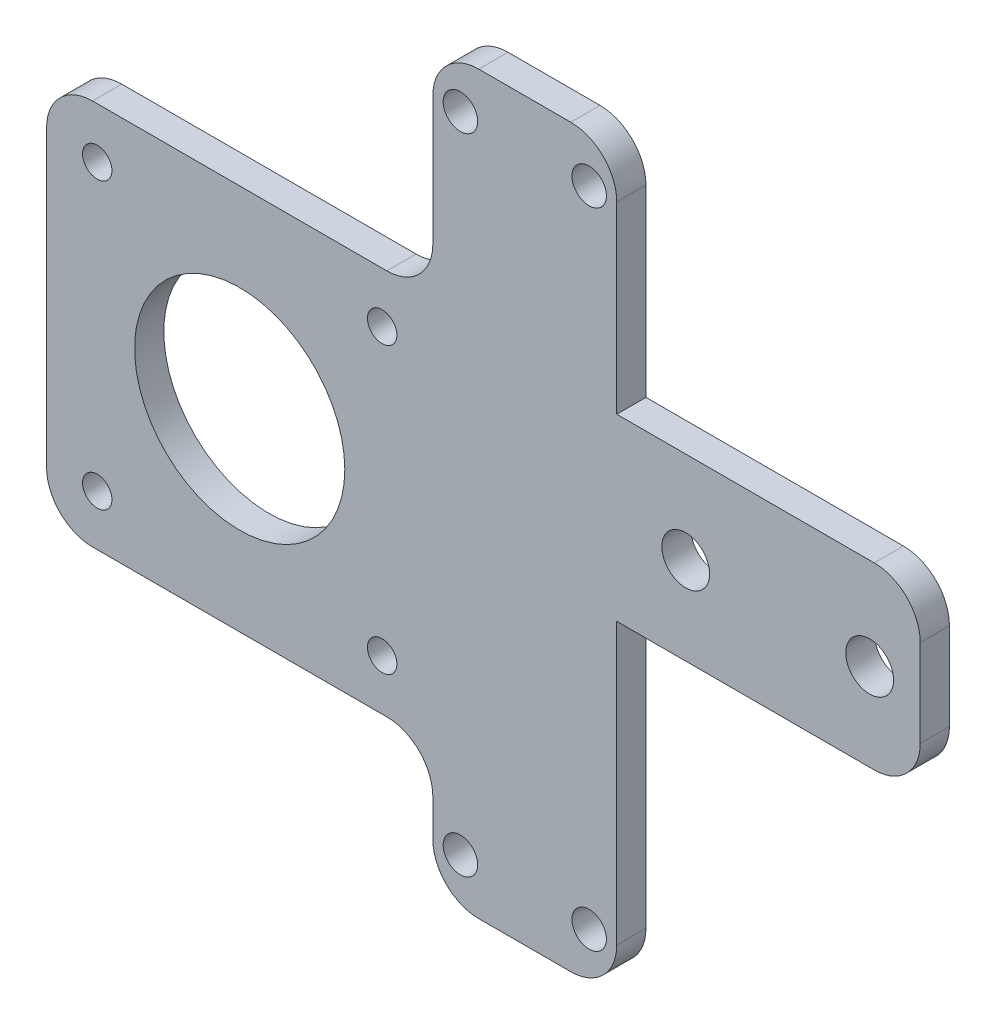
ISO-10303-21;
HEADER;
FILE_DESCRIPTION(('STEP AP214'),'2;1');
FILE_NAME('part.step','',(''),(''),'','','');
FILE_SCHEMA(('AUTOMOTIVE_DESIGN { 1 0 10303 214 1 1 1 1 }'));
ENDSEC;
DATA;
#1=APPLICATION_CONTEXT('core data for automotive mechanical design processes');
#2=APPLICATION_PROTOCOL_DEFINITION('international standard','automotive_design',2000,#1);
#3=PRODUCT_CONTEXT('',#1,'mechanical');
#4=PRODUCT('Part','Part','',(#3));
#5=PRODUCT_RELATED_PRODUCT_CATEGORY('part','',(#4));
#6=PRODUCT_DEFINITION_FORMATION('','',#4);
#7=PRODUCT_DEFINITION_CONTEXT('part definition',#1,'design');
#8=PRODUCT_DEFINITION('design','',#6,#7);
#9=PRODUCT_DEFINITION_SHAPE('','',#8);
#10=(LENGTH_UNIT() NAMED_UNIT(*) SI_UNIT(.MILLI.,.METRE.));
#11=(NAMED_UNIT(*) PLANE_ANGLE_UNIT() SI_UNIT($,.RADIAN.));
#12=(NAMED_UNIT(*) SI_UNIT($,.STERADIAN.) SOLID_ANGLE_UNIT());
#13=UNCERTAINTY_MEASURE_WITH_UNIT(LENGTH_MEASURE(1.E-05),#10,'distance_accuracy_value','');
#14=(GEOMETRIC_REPRESENTATION_CONTEXT(3) GLOBAL_UNCERTAINTY_ASSIGNED_CONTEXT((#13)) GLOBAL_UNIT_ASSIGNED_CONTEXT((#10,
#11,#12)) REPRESENTATION_CONTEXT('',''));
#15=CARTESIAN_POINT('',(0.,0.,0.));
#16=DIRECTION('',(0.,0.,1.));
#17=DIRECTION('',(1.,0.,0.));
#18=AXIS2_PLACEMENT_3D('',#15,#16,#17);
#19=CARTESIAN_POINT('',(-37.,51.,0.));
#20=DIRECTION('',(0.,0.,1.));
#21=DIRECTION('',(1.,0.,0.));
#22=AXIS2_PLACEMENT_3D('',#19,#20,#21);
#23=CYLINDRICAL_SURFACE('',#22,4.99999999999999);
#24=CARTESIAN_POINT('',(-37.,51.,3.175));
#25=DIRECTION('',(0.,0.,1.));
#26=DIRECTION('',(1.,0.,0.));
#27=AXIS2_PLACEMENT_3D('',#24,#25,#26);
#28=CIRCLE('',#27,4.99999999999999);
#29=CARTESIAN_POINT('',(-37.,56.,3.175));
#30=VERTEX_POINT('',#29);
#31=CARTESIAN_POINT('',(-42.,51.,3.175));
#32=VERTEX_POINT('',#31);
#33=EDGE_CURVE('E215',#30,#32,#28,.T.);
#34=ORIENTED_EDGE('',*,*,#33,.F.);
#35=DIRECTION('',(0.,0.,1.));
#36=VECTOR('',#35,1.);
#37=CARTESIAN_POINT('',(-37.,56.,0.));
#38=LINE('',#37,#36);
#39=CARTESIAN_POINT('',(-37.,56.,0.));
#40=VERTEX_POINT('',#39);
#41=EDGE_CURVE('E11',#40,#30,#38,.T.);
#42=ORIENTED_EDGE('',*,*,#41,.F.);
#43=CARTESIAN_POINT('',(-37.,51.,0.));
#44=DIRECTION('',(0.,0.,1.));
#45=DIRECTION('',(1.,0.,0.));
#46=AXIS2_PLACEMENT_3D('',#43,#44,#45);
#47=CIRCLE('',#46,4.99999999999999);
#48=CARTESIAN_POINT('',(-42.,51.,0.));
#49=VERTEX_POINT('',#48);
#50=EDGE_CURVE('E278',#40,#49,#47,.T.);
#51=ORIENTED_EDGE('',*,*,#50,.T.);
#52=DIRECTION('',(0.,0.,1.));
#53=VECTOR('',#52,1.);
#54=CARTESIAN_POINT('',(-42.,51.,0.));
#55=LINE('',#54,#53);
#56=EDGE_CURVE('E37',#49,#32,#55,.T.);
#57=ORIENTED_EDGE('',*,*,#56,.T.);
#58=EDGE_LOOP('',(#34,#42,#51,#57));
#59=FACE_BOUND('',#58,.T.);
#60=ADVANCED_FACE('F34',(#59),#23,.T.);
#61=CARTESIAN_POINT('',(-5.,56.,0.));
#62=DIRECTION('',(0.,1.,0.));
#63=DIRECTION('',(0.,0.,1.));
#64=AXIS2_PLACEMENT_3D('',#61,#62,#63);
#65=PLANE('',#64);
#66=DIRECTION('',(-1.,0.,0.));
#67=VECTOR('',#66,1.);
#68=CARTESIAN_POINT('',(-5.,56.,3.175));
#69=LINE('',#68,#67);
#70=CARTESIAN_POINT('',(-5.,56.,3.175));
#71=VERTEX_POINT('',#70);
#72=EDGE_CURVE('E276',#71,#30,#69,.T.);
#73=ORIENTED_EDGE('',*,*,#72,.F.);
#74=DIRECTION('',(0.,0.,1.));
#75=VECTOR('',#74,1.);
#76=CARTESIAN_POINT('',(-5.,56.,0.));
#77=LINE('',#76,#75);
#78=CARTESIAN_POINT('',(-5.,56.,0.));
#79=VERTEX_POINT('',#78);
#80=EDGE_CURVE('E43',#79,#71,#77,.T.);
#81=ORIENTED_EDGE('',*,*,#80,.F.);
#82=DIRECTION('',(-1.,0.,0.));
#83=VECTOR('',#82,1.);
#84=CARTESIAN_POINT('',(-5.,56.,0.));
#85=LINE('',#84,#83);
#86=EDGE_CURVE('E205',#79,#40,#85,.T.);
#87=ORIENTED_EDGE('',*,*,#86,.T.);
#88=ORIENTED_EDGE('',*,*,#41,.T.);
#89=EDGE_LOOP('',(#73,#81,#87,#88));
#90=FACE_BOUND('',#89,.T.);
#91=ADVANCED_FACE('F318',(#90),#65,.T.);
#92=CARTESIAN_POINT('',(-5.,61.,0.));
#93=DIRECTION('',(0.,0.,1.));
#94=DIRECTION('',(1.,0.,0.));
#95=AXIS2_PLACEMENT_3D('',#92,#93,#94);
#96=CYLINDRICAL_SURFACE('',#95,5.);
#97=CARTESIAN_POINT('',(-5.,61.,3.175));
#98=DIRECTION('',(0.,0.,-1.));
#99=DIRECTION('',(-1.,0.,0.));
#100=AXIS2_PLACEMENT_3D('',#97,#98,#99);
#101=CIRCLE('',#100,5.);
#102=CARTESIAN_POINT('',(0.,61.,3.175));
#103=VERTEX_POINT('',#102);
#104=EDGE_CURVE('E192',#103,#71,#101,.T.);
#105=ORIENTED_EDGE('',*,*,#104,.F.);
#106=DIRECTION('',(0.,0.,1.));
#107=VECTOR('',#106,1.);
#108=CARTESIAN_POINT('',(0.,61.,0.));
#109=LINE('',#108,#107);
#110=CARTESIAN_POINT('',(0.,61.,0.));
#111=VERTEX_POINT('',#110);
#112=EDGE_CURVE('E187',#111,#103,#109,.T.);
#113=ORIENTED_EDGE('',*,*,#112,.F.);
#114=CARTESIAN_POINT('',(-5.,61.,0.));
#115=DIRECTION('',(0.,0.,-1.));
#116=DIRECTION('',(-1.,0.,0.));
#117=AXIS2_PLACEMENT_3D('',#114,#115,#116);
#118=CIRCLE('',#117,5.);
#119=EDGE_CURVE('E190',#111,#79,#118,.T.);
#120=ORIENTED_EDGE('',*,*,#119,.T.);
#121=ORIENTED_EDGE('',*,*,#80,.T.);
#122=EDGE_LOOP('',(#105,#113,#120,#121));
#123=FACE_BOUND('',#122,.T.);
#124=ADVANCED_FACE('F189',(#123),#96,.F.);
#125=CARTESIAN_POINT('',(0.,75.,0.));
#126=DIRECTION('',(-1.,0.,0.));
#127=DIRECTION('',(0.,-1.,0.));
#128=AXIS2_PLACEMENT_3D('',#125,#126,#127);
#129=PLANE('',#128);
#130=DIRECTION('',(0.,-1.,0.));
#131=VECTOR('',#130,1.);
#132=CARTESIAN_POINT('',(0.,75.,3.175));
#133=LINE('',#132,#131);
#134=CARTESIAN_POINT('',(0.,75.,3.175));
#135=VERTEX_POINT('',#134);
#136=EDGE_CURVE('E273',#135,#103,#133,.T.);
#137=ORIENTED_EDGE('',*,*,#136,.F.);
#138=DIRECTION('',(0.,0.,1.));
#139=VECTOR('',#138,1.);
#140=CARTESIAN_POINT('',(0.,75.,0.));
#141=LINE('',#140,#139);
#142=CARTESIAN_POINT('',(0.,75.,0.));
#143=VERTEX_POINT('',#142);
#144=EDGE_CURVE('E197',#143,#135,#141,.T.);
#145=ORIENTED_EDGE('',*,*,#144,.F.);
#146=DIRECTION('',(0.,-1.,0.));
#147=VECTOR('',#146,1.);
#148=CARTESIAN_POINT('',(0.,75.,0.));
#149=LINE('',#148,#147);
#150=EDGE_CURVE('E203',#143,#111,#149,.T.);
#151=ORIENTED_EDGE('',*,*,#150,.T.);
#152=ORIENTED_EDGE('',*,*,#112,.T.);
#153=EDGE_LOOP('',(#137,#145,#151,#152));
#154=FACE_BOUND('',#153,.T.);
#155=ADVANCED_FACE('F207',(#154),#129,.T.);
#156=CARTESIAN_POINT('',(5.,75.,0.));
#157=DIRECTION('',(0.,0.,1.));
#158=DIRECTION('',(1.,0.,0.));
#159=AXIS2_PLACEMENT_3D('',#156,#157,#158);
#160=CYLINDRICAL_SURFACE('',#159,5.);
#161=CARTESIAN_POINT('',(5.,75.,3.175));
#162=DIRECTION('',(0.,0.,1.));
#163=DIRECTION('',(1.,0.,0.));
#164=AXIS2_PLACEMENT_3D('',#161,#162,#163);
#165=CIRCLE('',#164,5.);
#166=CARTESIAN_POINT('',(5.,80.,3.175));
#167=VERTEX_POINT('',#166);
#168=EDGE_CURVE('E270',#167,#135,#165,.T.);
#169=ORIENTED_EDGE('',*,*,#168,.F.);
#170=DIRECTION('',(0.,0.,1.));
#171=VECTOR('',#170,1.);
#172=CARTESIAN_POINT('',(5.,80.,0.));
#173=LINE('',#172,#171);
#174=CARTESIAN_POINT('',(5.,80.,0.));
#175=VERTEX_POINT('',#174);
#176=EDGE_CURVE('E282',#175,#167,#173,.T.);
#177=ORIENTED_EDGE('',*,*,#176,.F.);
#178=CARTESIAN_POINT('',(5.,75.,0.));
#179=DIRECTION('',(0.,0.,1.));
#180=DIRECTION('',(1.,0.,0.));
#181=AXIS2_PLACEMENT_3D('',#178,#179,#180);
#182=CIRCLE('',#181,5.);
#183=EDGE_CURVE('E208',#175,#143,#182,.T.);
#184=ORIENTED_EDGE('',*,*,#183,.T.);
#185=ORIENTED_EDGE('',*,*,#144,.T.);
#186=EDGE_LOOP('',(#169,#177,#184,#185));
#187=FACE_BOUND('',#186,.T.);
#188=ADVANCED_FACE('F331',(#187),#160,.T.);
#189=CARTESIAN_POINT('',(15.,80.,0.));
#190=DIRECTION('',(0.,1.,0.));
#191=DIRECTION('',(0.,0.,1.));
#192=AXIS2_PLACEMENT_3D('',#189,#190,#191);
#193=PLANE('',#192);
#194=DIRECTION('',(-1.,0.,0.));
#195=VECTOR('',#194,1.);
#196=CARTESIAN_POINT('',(15.,80.,3.175));
#197=LINE('',#196,#195);
#198=CARTESIAN_POINT('',(15.,80.,3.175));
#199=VERTEX_POINT('',#198);
#200=EDGE_CURVE('E267',#199,#167,#197,.T.);
#201=ORIENTED_EDGE('',*,*,#200,.F.);
#202=DIRECTION('',(0.,0.,1.));
#203=VECTOR('',#202,1.);
#204=CARTESIAN_POINT('',(15.,80.,0.));
#205=LINE('',#204,#203);
#206=CARTESIAN_POINT('',(15.,80.,0.));
#207=VERTEX_POINT('',#206);
#208=EDGE_CURVE('E284',#207,#199,#205,.T.);
#209=ORIENTED_EDGE('',*,*,#208,.F.);
#210=DIRECTION('',(-1.,0.,0.));
#211=VECTOR('',#210,1.);
#212=CARTESIAN_POINT('',(15.,80.,0.));
#213=LINE('',#212,#211);
#214=EDGE_CURVE('E210',#207,#175,#213,.T.);
#215=ORIENTED_EDGE('',*,*,#214,.T.);
#216=ORIENTED_EDGE('',*,*,#176,.T.);
#217=EDGE_LOOP('',(#201,#209,#215,#216));
#218=FACE_BOUND('',#217,.T.);
#219=ADVANCED_FACE('F334',(#218),#193,.T.);
#220=CARTESIAN_POINT('',(15.,75.,0.));
#221=DIRECTION('',(0.,0.,1.));
#222=DIRECTION('',(1.,0.,0.));
#223=AXIS2_PLACEMENT_3D('',#220,#221,#222);
#224=CYLINDRICAL_SURFACE('',#223,5.);
#225=CARTESIAN_POINT('',(15.,75.,3.175));
#226=DIRECTION('',(0.,0.,1.));
#227=DIRECTION('',(1.,0.,0.));
#228=AXIS2_PLACEMENT_3D('',#225,#226,#227);
#229=CIRCLE('',#228,5.);
#230=CARTESIAN_POINT('',(20.,75.,3.175));
#231=VERTEX_POINT('',#230);
#232=EDGE_CURVE('E264',#231,#199,#229,.T.);
#233=ORIENTED_EDGE('',*,*,#232,.F.);
#234=DIRECTION('',(0.,0.,1.));
#235=VECTOR('',#234,1.);
#236=CARTESIAN_POINT('',(20.,75.,0.));
#237=LINE('',#236,#235);
#238=CARTESIAN_POINT('',(20.,75.,0.));
#239=VERTEX_POINT('',#238);
#240=EDGE_CURVE('E286',#239,#231,#237,.T.);
#241=ORIENTED_EDGE('',*,*,#240,.F.);
#242=CARTESIAN_POINT('',(15.,75.,0.));
#243=DIRECTION('',(0.,0.,1.));
#244=DIRECTION('',(1.,0.,0.));
#245=AXIS2_PLACEMENT_3D('',#242,#243,#244);
#246=CIRCLE('',#245,5.);
#247=EDGE_CURVE('E568',#239,#207,#246,.T.);
#248=ORIENTED_EDGE('',*,*,#247,.T.);
#249=ORIENTED_EDGE('',*,*,#208,.T.);
#250=EDGE_LOOP('',(#233,#241,#248,#249));
#251=FACE_BOUND('',#250,.T.);
#252=ADVANCED_FACE('F338',(#251),#224,.T.);
#253=CARTESIAN_POINT('',(20.,55.,0.));
#254=DIRECTION('',(1.,0.,0.));
#255=DIRECTION('',(0.,1.,0.));
#256=AXIS2_PLACEMENT_3D('',#253,#254,#255);
#257=PLANE('',#256);
#258=DIRECTION('',(0.,1.,0.));
#259=VECTOR('',#258,1.);
#260=CARTESIAN_POINT('',(20.,55.,3.175));
#261=LINE('',#260,#259);
#262=CARTESIAN_POINT('',(20.,55.,3.175));
#263=VERTEX_POINT('',#262);
#264=EDGE_CURVE('E261',#263,#231,#261,.T.);
#265=ORIENTED_EDGE('',*,*,#264,.F.);
#266=DIRECTION('',(0.,0.,1.));
#267=VECTOR('',#266,1.);
#268=CARTESIAN_POINT('',(20.,55.,0.));
#269=LINE('',#268,#267);
#270=CARTESIAN_POINT('',(20.,55.,0.));
#271=VERTEX_POINT('',#270);
#272=EDGE_CURVE('E288',#271,#263,#269,.T.);
#273=ORIENTED_EDGE('',*,*,#272,.F.);
#274=DIRECTION('',(0.,1.,0.));
#275=VECTOR('',#274,1.);
#276=CARTESIAN_POINT('',(20.,55.,0.));
#277=LINE('',#276,#275);
#278=EDGE_CURVE('E565',#271,#239,#277,.T.);
#279=ORIENTED_EDGE('',*,*,#278,.T.);
#280=ORIENTED_EDGE('',*,*,#240,.T.);
#281=EDGE_LOOP('',(#265,#273,#279,#280));
#282=FACE_BOUND('',#281,.T.);
#283=ADVANCED_FACE('F342',(#282),#257,.T.);
#284=CARTESIAN_POINT('',(48.,55.,0.));
#285=DIRECTION('',(0.,1.,0.));
#286=DIRECTION('',(0.,0.,1.));
#287=AXIS2_PLACEMENT_3D('',#284,#285,#286);
#288=PLANE('',#287);
#289=DIRECTION('',(-1.,0.,0.));
#290=VECTOR('',#289,1.);
#291=CARTESIAN_POINT('',(48.,55.,3.175));
#292=LINE('',#291,#290);
#293=CARTESIAN_POINT('',(48.,55.,3.175));
#294=VERTEX_POINT('',#293);
#295=EDGE_CURVE('E258',#294,#263,#292,.T.);
#296=ORIENTED_EDGE('',*,*,#295,.F.);
#297=DIRECTION('',(0.,0.,1.));
#298=VECTOR('',#297,1.);
#299=CARTESIAN_POINT('',(48.,55.,0.));
#300=LINE('',#299,#298);
#301=CARTESIAN_POINT('',(48.,55.,0.));
#302=VERTEX_POINT('',#301);
#303=EDGE_CURVE('E290',#302,#294,#300,.T.);
#304=ORIENTED_EDGE('',*,*,#303,.F.);
#305=DIRECTION('',(-1.,0.,0.));
#306=VECTOR('',#305,1.);
#307=CARTESIAN_POINT('',(48.,55.,0.));
#308=LINE('',#307,#306);
#309=EDGE_CURVE('E562',#302,#271,#308,.T.);
#310=ORIENTED_EDGE('',*,*,#309,.T.);
#311=ORIENTED_EDGE('',*,*,#272,.T.);
#312=EDGE_LOOP('',(#296,#304,#310,#311));
#313=FACE_BOUND('',#312,.T.);
#314=ADVANCED_FACE('F346',(#313),#288,.T.);
#315=CARTESIAN_POINT('',(48.,50.,0.));
#316=DIRECTION('',(0.,0.,1.));
#317=DIRECTION('',(1.,0.,0.));
#318=AXIS2_PLACEMENT_3D('',#315,#316,#317);
#319=CYLINDRICAL_SURFACE('',#318,5.);
#320=CARTESIAN_POINT('',(48.,50.,3.175));
#321=DIRECTION('',(0.,0.,1.));
#322=DIRECTION('',(1.,0.,0.));
#323=AXIS2_PLACEMENT_3D('',#320,#321,#322);
#324=CIRCLE('',#323,5.);
#325=CARTESIAN_POINT('',(53.,50.,3.175));
#326=VERTEX_POINT('',#325);
#327=EDGE_CURVE('E255',#326,#294,#324,.T.);
#328=ORIENTED_EDGE('',*,*,#327,.F.);
#329=DIRECTION('',(0.,0.,1.));
#330=VECTOR('',#329,1.);
#331=CARTESIAN_POINT('',(53.,50.,0.));
#332=LINE('',#331,#330);
#333=CARTESIAN_POINT('',(53.,50.,0.));
#334=VERTEX_POINT('',#333);
#335=EDGE_CURVE('E292',#334,#326,#332,.T.);
#336=ORIENTED_EDGE('',*,*,#335,.F.);
#337=CARTESIAN_POINT('',(48.,50.,0.));
#338=DIRECTION('',(0.,0.,1.));
#339=DIRECTION('',(1.,0.,0.));
#340=AXIS2_PLACEMENT_3D('',#337,#338,#339);
#341=CIRCLE('',#340,5.);
#342=EDGE_CURVE('E559',#334,#302,#341,.T.);
#343=ORIENTED_EDGE('',*,*,#342,.T.);
#344=ORIENTED_EDGE('',*,*,#303,.T.);
#345=EDGE_LOOP('',(#328,#336,#343,#344));
#346=FACE_BOUND('',#345,.T.);
#347=ADVANCED_FACE('F350',(#346),#319,.T.);
#348=CARTESIAN_POINT('',(53.,40.4999995231628,0.));
#349=DIRECTION('',(1.,0.,0.));
#350=DIRECTION('',(0.,0.,-1.));
#351=AXIS2_PLACEMENT_3D('',#348,#349,#350);
#352=PLANE('',#351);
#353=DIRECTION('',(0.,1.,0.));
#354=VECTOR('',#353,1.);
#355=CARTESIAN_POINT('',(53.,40.4999995231628,3.175));
#356=LINE('',#355,#354);
#357=CARTESIAN_POINT('',(53.,40.4999995231628,3.175));
#358=VERTEX_POINT('',#357);
#359=EDGE_CURVE('E252',#358,#326,#356,.T.);
#360=ORIENTED_EDGE('',*,*,#359,.F.);
#361=DIRECTION('',(0.,0.,1.));
#362=VECTOR('',#361,1.);
#363=CARTESIAN_POINT('',(53.,40.4999995231628,0.));
#364=LINE('',#363,#362);
#365=CARTESIAN_POINT('',(53.,40.4999995231628,0.));
#366=VERTEX_POINT('',#365);
#367=EDGE_CURVE('E294',#366,#358,#364,.T.);
#368=ORIENTED_EDGE('',*,*,#367,.F.);
#369=DIRECTION('',(0.,1.,0.));
#370=VECTOR('',#369,1.);
#371=CARTESIAN_POINT('',(53.,40.4999995231628,0.));
#372=LINE('',#371,#370);
#373=EDGE_CURVE('E556',#366,#334,#372,.T.);
#374=ORIENTED_EDGE('',*,*,#373,.T.);
#375=ORIENTED_EDGE('',*,*,#335,.T.);
#376=EDGE_LOOP('',(#360,#368,#374,#375));
#377=FACE_BOUND('',#376,.T.);
#378=ADVANCED_FACE('F354',(#377),#352,.T.);
#379=CARTESIAN_POINT('',(48.,40.4999995231628,0.));
#380=DIRECTION('',(0.,0.,1.));
#381=DIRECTION('',(1.,0.,0.));
#382=AXIS2_PLACEMENT_3D('',#379,#380,#381);
#383=CYLINDRICAL_SURFACE('',#382,5.);
#384=CARTESIAN_POINT('',(48.,40.4999995231628,3.175));
#385=DIRECTION('',(0.,0.,1.));
#386=DIRECTION('',(1.,0.,0.));
#387=AXIS2_PLACEMENT_3D('',#384,#385,#386);
#388=CIRCLE('',#387,5.);
#389=CARTESIAN_POINT('',(48.,35.4999995231628,3.175));
#390=VERTEX_POINT('',#389);
#391=EDGE_CURVE('E249',#390,#358,#388,.T.);
#392=ORIENTED_EDGE('',*,*,#391,.F.);
#393=DIRECTION('',(0.,0.,1.));
#394=VECTOR('',#393,1.);
#395=CARTESIAN_POINT('',(48.,35.4999995231628,0.));
#396=LINE('',#395,#394);
#397=CARTESIAN_POINT('',(48.,35.4999995231628,0.));
#398=VERTEX_POINT('',#397);
#399=EDGE_CURVE('E296',#398,#390,#396,.T.);
#400=ORIENTED_EDGE('',*,*,#399,.F.);
#401=CARTESIAN_POINT('',(48.,40.4999995231628,0.));
#402=DIRECTION('',(0.,0.,1.));
#403=DIRECTION('',(1.,0.,0.));
#404=AXIS2_PLACEMENT_3D('',#401,#402,#403);
#405=CIRCLE('',#404,5.);
#406=EDGE_CURVE('E553',#398,#366,#405,.T.);
#407=ORIENTED_EDGE('',*,*,#406,.T.);
#408=ORIENTED_EDGE('',*,*,#367,.T.);
#409=EDGE_LOOP('',(#392,#400,#407,#408));
#410=FACE_BOUND('',#409,.T.);
#411=ADVANCED_FACE('F358',(#410),#383,.T.);
#412=CARTESIAN_POINT('',(20.,35.4999995231628,0.));
#413=DIRECTION('',(0.,-1.,0.));
#414=DIRECTION('',(0.,0.,-1.));
#415=AXIS2_PLACEMENT_3D('',#412,#413,#414);
#416=PLANE('',#415);
#417=DIRECTION('',(1.,0.,0.));
#418=VECTOR('',#417,1.);
#419=CARTESIAN_POINT('',(20.,35.4999995231628,3.175));
#420=LINE('',#419,#418);
#421=CARTESIAN_POINT('',(20.,35.4999995231628,3.175));
#422=VERTEX_POINT('',#421);
#423=EDGE_CURVE('E246',#422,#390,#420,.T.);
#424=ORIENTED_EDGE('',*,*,#423,.F.);
#425=DIRECTION('',(0.,0.,1.));
#426=VECTOR('',#425,1.);
#427=CARTESIAN_POINT('',(20.,35.4999995231628,0.));
#428=LINE('',#427,#426);
#429=CARTESIAN_POINT('',(20.,35.4999995231628,0.));
#430=VERTEX_POINT('',#429);
#431=EDGE_CURVE('E298',#430,#422,#428,.T.);
#432=ORIENTED_EDGE('',*,*,#431,.F.);
#433=DIRECTION('',(1.,0.,0.));
#434=VECTOR('',#433,1.);
#435=CARTESIAN_POINT('',(20.,35.4999995231628,0.));
#436=LINE('',#435,#434);
#437=EDGE_CURVE('E550',#430,#398,#436,.T.);
#438=ORIENTED_EDGE('',*,*,#437,.T.);
#439=ORIENTED_EDGE('',*,*,#399,.T.);
#440=EDGE_LOOP('',(#424,#432,#438,#439));
#441=FACE_BOUND('',#440,.T.);
#442=ADVANCED_FACE('F362',(#441),#416,.T.);
#443=CARTESIAN_POINT('',(20.,5.,0.));
#444=DIRECTION('',(1.,0.,0.));
#445=DIRECTION('',(0.,1.,0.));
#446=AXIS2_PLACEMENT_3D('',#443,#444,#445);
#447=PLANE('',#446);
#448=DIRECTION('',(0.,1.,0.));
#449=VECTOR('',#448,1.);
#450=CARTESIAN_POINT('',(20.,5.,3.175));
#451=LINE('',#450,#449);
#452=CARTESIAN_POINT('',(20.,5.,3.175));
#453=VERTEX_POINT('',#452);
#454=EDGE_CURVE('E243',#453,#422,#451,.T.);
#455=ORIENTED_EDGE('',*,*,#454,.F.);
#456=DIRECTION('',(0.,0.,1.));
#457=VECTOR('',#456,1.);
#458=CARTESIAN_POINT('',(20.,5.,0.));
#459=LINE('',#458,#457);
#460=CARTESIAN_POINT('',(20.,5.,0.));
#461=VERTEX_POINT('',#460);
#462=EDGE_CURVE('E300',#461,#453,#459,.T.);
#463=ORIENTED_EDGE('',*,*,#462,.F.);
#464=DIRECTION('',(0.,1.,0.));
#465=VECTOR('',#464,1.);
#466=CARTESIAN_POINT('',(20.,5.,0.));
#467=LINE('',#466,#465);
#468=EDGE_CURVE('E547',#461,#430,#467,.T.);
#469=ORIENTED_EDGE('',*,*,#468,.T.);
#470=ORIENTED_EDGE('',*,*,#431,.T.);
#471=EDGE_LOOP('',(#455,#463,#469,#470));
#472=FACE_BOUND('',#471,.T.);
#473=ADVANCED_FACE('F366',(#472),#447,.T.);
#474=CARTESIAN_POINT('',(15.,5.,0.));
#475=DIRECTION('',(0.,0.,1.));
#476=DIRECTION('',(1.,0.,0.));
#477=AXIS2_PLACEMENT_3D('',#474,#475,#476);
#478=CYLINDRICAL_SURFACE('',#477,5.);
#479=CARTESIAN_POINT('',(15.,5.,3.175));
#480=DIRECTION('',(0.,0.,1.));
#481=DIRECTION('',(1.,0.,0.));
#482=AXIS2_PLACEMENT_3D('',#479,#480,#481);
#483=CIRCLE('',#482,5.);
#484=CARTESIAN_POINT('',(15.,0.,3.175));
#485=VERTEX_POINT('',#484);
#486=EDGE_CURVE('E240',#485,#453,#483,.T.);
#487=ORIENTED_EDGE('',*,*,#486,.F.);
#488=DIRECTION('',(0.,0.,1.));
#489=VECTOR('',#488,1.);
#490=CARTESIAN_POINT('',(15.,0.,0.));
#491=LINE('',#490,#489);
#492=CARTESIAN_POINT('',(15.,0.,0.));
#493=VERTEX_POINT('',#492);
#494=EDGE_CURVE('E302',#493,#485,#491,.T.);
#495=ORIENTED_EDGE('',*,*,#494,.F.);
#496=CARTESIAN_POINT('',(15.,5.,0.));
#497=DIRECTION('',(0.,0.,1.));
#498=DIRECTION('',(1.,0.,0.));
#499=AXIS2_PLACEMENT_3D('',#496,#497,#498);
#500=CIRCLE('',#499,5.);
#501=EDGE_CURVE('E544',#493,#461,#500,.T.);
#502=ORIENTED_EDGE('',*,*,#501,.T.);
#503=ORIENTED_EDGE('',*,*,#462,.T.);
#504=EDGE_LOOP('',(#487,#495,#502,#503));
#505=FACE_BOUND('',#504,.T.);
#506=ADVANCED_FACE('F370',(#505),#478,.T.);
#507=CARTESIAN_POINT('',(5.,0.,0.));
#508=DIRECTION('',(0.,-1.,0.));
#509=DIRECTION('',(0.,0.,-1.));
#510=AXIS2_PLACEMENT_3D('',#507,#508,#509);
#511=PLANE('',#510);
#512=DIRECTION('',(1.,0.,0.));
#513=VECTOR('',#512,1.);
#514=CARTESIAN_POINT('',(5.,0.,3.175));
#515=LINE('',#514,#513);
#516=CARTESIAN_POINT('',(5.,0.,3.175));
#517=VERTEX_POINT('',#516);
#518=EDGE_CURVE('E237',#517,#485,#515,.T.);
#519=ORIENTED_EDGE('',*,*,#518,.F.);
#520=DIRECTION('',(0.,0.,1.));
#521=VECTOR('',#520,1.);
#522=CARTESIAN_POINT('',(5.,0.,0.));
#523=LINE('',#522,#521);
#524=CARTESIAN_POINT('',(5.,0.,0.));
#525=VERTEX_POINT('',#524);
#526=EDGE_CURVE('E304',#525,#517,#523,.T.);
#527=ORIENTED_EDGE('',*,*,#526,.F.);
#528=DIRECTION('',(1.,0.,0.));
#529=VECTOR('',#528,1.);
#530=CARTESIAN_POINT('',(5.,0.,0.));
#531=LINE('',#530,#529);
#532=EDGE_CURVE('E541',#525,#493,#531,.T.);
#533=ORIENTED_EDGE('',*,*,#532,.T.);
#534=ORIENTED_EDGE('',*,*,#494,.T.);
#535=EDGE_LOOP('',(#519,#527,#533,#534));
#536=FACE_BOUND('',#535,.T.);
#537=ADVANCED_FACE('F374',(#536),#511,.T.);
#538=CARTESIAN_POINT('',(5.,5.,0.));
#539=DIRECTION('',(0.,0.,1.));
#540=DIRECTION('',(1.,0.,0.));
#541=AXIS2_PLACEMENT_3D('',#538,#539,#540);
#542=CYLINDRICAL_SURFACE('',#541,5.);
#543=CARTESIAN_POINT('',(5.,5.,3.175));
#544=DIRECTION('',(0.,0.,1.));
#545=DIRECTION('',(1.,0.,0.));
#546=AXIS2_PLACEMENT_3D('',#543,#544,#545);
#547=CIRCLE('',#546,5.);
#548=CARTESIAN_POINT('',(0.,5.,3.175));
#549=VERTEX_POINT('',#548);
#550=EDGE_CURVE('E234',#549,#517,#547,.T.);
#551=ORIENTED_EDGE('',*,*,#550,.F.);
#552=DIRECTION('',(0.,0.,1.));
#553=VECTOR('',#552,1.);
#554=CARTESIAN_POINT('',(0.,5.,0.));
#555=LINE('',#554,#553);
#556=CARTESIAN_POINT('',(0.,5.,0.));
#557=VERTEX_POINT('',#556);
#558=EDGE_CURVE('E306',#557,#549,#555,.T.);
#559=ORIENTED_EDGE('',*,*,#558,.F.);
#560=CARTESIAN_POINT('',(5.,5.,0.));
#561=DIRECTION('',(0.,0.,1.));
#562=DIRECTION('',(1.,0.,0.));
#563=AXIS2_PLACEMENT_3D('',#560,#561,#562);
#564=CIRCLE('',#563,5.);
#565=EDGE_CURVE('E538',#557,#525,#564,.T.);
#566=ORIENTED_EDGE('',*,*,#565,.T.);
#567=ORIENTED_EDGE('',*,*,#526,.T.);
#568=EDGE_LOOP('',(#551,#559,#566,#567));
#569=FACE_BOUND('',#568,.T.);
#570=ADVANCED_FACE('F378',(#569),#542,.T.);
#571=CARTESIAN_POINT('',(0.,9.00000000000001,0.));
#572=DIRECTION('',(-1.,0.,0.));
#573=DIRECTION('',(0.,0.,1.));
#574=AXIS2_PLACEMENT_3D('',#571,#572,#573);
#575=PLANE('',#574);
#576=DIRECTION('',(0.,-1.,0.));
#577=VECTOR('',#576,1.);
#578=CARTESIAN_POINT('',(0.,9.00000000000001,3.175));
#579=LINE('',#578,#577);
#580=CARTESIAN_POINT('',(0.,9.00000000000001,3.175));
#581=VERTEX_POINT('',#580);
#582=EDGE_CURVE('E231',#581,#549,#579,.T.);
#583=ORIENTED_EDGE('',*,*,#582,.F.);
#584=DIRECTION('',(0.,0.,1.));
#585=VECTOR('',#584,1.);
#586=CARTESIAN_POINT('',(0.,9.00000000000001,0.));
#587=LINE('',#586,#585);
#588=CARTESIAN_POINT('',(0.,9.00000000000001,0.));
#589=VERTEX_POINT('',#588);
#590=EDGE_CURVE('E308',#589,#581,#587,.T.);
#591=ORIENTED_EDGE('',*,*,#590,.F.);
#592=DIRECTION('',(0.,-1.,0.));
#593=VECTOR('',#592,1.);
#594=CARTESIAN_POINT('',(0.,9.00000000000001,0.));
#595=LINE('',#594,#593);
#596=EDGE_CURVE('E535',#589,#557,#595,.T.);
#597=ORIENTED_EDGE('',*,*,#596,.T.);
#598=ORIENTED_EDGE('',*,*,#558,.T.);
#599=EDGE_LOOP('',(#583,#591,#597,#598));
#600=FACE_BOUND('',#599,.T.);
#601=ADVANCED_FACE('F382',(#600),#575,.T.);
#602=CARTESIAN_POINT('',(-5.,9.00000000000001,0.));
#603=DIRECTION('',(0.,0.,1.));
#604=DIRECTION('',(1.,0.,0.));
#605=AXIS2_PLACEMENT_3D('',#602,#603,#604);
#606=CYLINDRICAL_SURFACE('',#605,5.);
#607=CARTESIAN_POINT('',(-5.,9.00000000000001,3.175));
#608=DIRECTION('',(0.,0.,-1.));
#609=DIRECTION('',(-1.,0.,0.));
#610=AXIS2_PLACEMENT_3D('',#607,#608,#609);
#611=CIRCLE('',#610,5.);
#612=CARTESIAN_POINT('',(-5.,14.,3.175));
#613=VERTEX_POINT('',#612);
#614=EDGE_CURVE('E228',#613,#581,#611,.T.);
#615=ORIENTED_EDGE('',*,*,#614,.F.);
#616=DIRECTION('',(0.,0.,1.));
#617=VECTOR('',#616,1.);
#618=CARTESIAN_POINT('',(-5.,14.,0.));
#619=LINE('',#618,#617);
#620=CARTESIAN_POINT('',(-5.,14.,0.));
#621=VERTEX_POINT('',#620);
#622=EDGE_CURVE('E310',#621,#613,#619,.T.);
#623=ORIENTED_EDGE('',*,*,#622,.F.);
#624=CARTESIAN_POINT('',(-5.,9.00000000000001,0.));
#625=DIRECTION('',(0.,0.,-1.));
#626=DIRECTION('',(-1.,0.,0.));
#627=AXIS2_PLACEMENT_3D('',#624,#625,#626);
#628=CIRCLE('',#627,5.);
#629=EDGE_CURVE('E532',#621,#589,#628,.T.);
#630=ORIENTED_EDGE('',*,*,#629,.T.);
#631=ORIENTED_EDGE('',*,*,#590,.T.);
#632=EDGE_LOOP('',(#615,#623,#630,#631));
#633=FACE_BOUND('',#632,.T.);
#634=ADVANCED_FACE('F386',(#633),#606,.F.);
#635=CARTESIAN_POINT('',(-37.,14.,0.));
#636=DIRECTION('',(0.,-1.,0.));
#637=DIRECTION('',(1.,0.,0.));
#638=AXIS2_PLACEMENT_3D('',#635,#636,#637);
#639=PLANE('',#638);
#640=DIRECTION('',(1.,0.,0.));
#641=VECTOR('',#640,1.);
#642=CARTESIAN_POINT('',(-37.,14.,3.175));
#643=LINE('',#642,#641);
#644=CARTESIAN_POINT('',(-37.,14.,3.175));
#645=VERTEX_POINT('',#644);
#646=EDGE_CURVE('E225',#645,#613,#643,.T.);
#647=ORIENTED_EDGE('',*,*,#646,.F.);
#648=DIRECTION('',(0.,0.,1.));
#649=VECTOR('',#648,1.);
#650=CARTESIAN_POINT('',(-37.,14.,0.));
#651=LINE('',#650,#649);
#652=CARTESIAN_POINT('',(-37.,14.,0.));
#653=VERTEX_POINT('',#652);
#654=EDGE_CURVE('E312',#653,#645,#651,.T.);
#655=ORIENTED_EDGE('',*,*,#654,.F.);
#656=DIRECTION('',(1.,0.,0.));
#657=VECTOR('',#656,1.);
#658=CARTESIAN_POINT('',(-37.,14.,0.));
#659=LINE('',#658,#657);
#660=EDGE_CURVE('E529',#653,#621,#659,.T.);
#661=ORIENTED_EDGE('',*,*,#660,.T.);
#662=ORIENTED_EDGE('',*,*,#622,.T.);
#663=EDGE_LOOP('',(#647,#655,#661,#662));
#664=FACE_BOUND('',#663,.T.);
#665=ADVANCED_FACE('F390',(#664),#639,.T.);
#666=CARTESIAN_POINT('',(-37.,19.,0.));
#667=DIRECTION('',(0.,0.,1.));
#668=DIRECTION('',(1.,0.,0.));
#669=AXIS2_PLACEMENT_3D('',#666,#667,#668);
#670=CYLINDRICAL_SURFACE('',#669,5.);
#671=CARTESIAN_POINT('',(-37.,19.,3.175));
#672=DIRECTION('',(0.,0.,1.));
#673=DIRECTION('',(1.,0.,0.));
#674=AXIS2_PLACEMENT_3D('',#671,#672,#673);
#675=CIRCLE('',#674,5.);
#676=CARTESIAN_POINT('',(-42.,19.,3.175));
#677=VERTEX_POINT('',#676);
#678=EDGE_CURVE('E222',#677,#645,#675,.T.);
#679=ORIENTED_EDGE('',*,*,#678,.F.);
#680=DIRECTION('',(0.,0.,1.));
#681=VECTOR('',#680,1.);
#682=CARTESIAN_POINT('',(-42.,19.,0.));
#683=LINE('',#682,#681);
#684=CARTESIAN_POINT('',(-42.,19.,0.));
#685=VERTEX_POINT('',#684);
#686=EDGE_CURVE('E313',#685,#677,#683,.T.);
#687=ORIENTED_EDGE('',*,*,#686,.F.);
#688=CARTESIAN_POINT('',(-37.,19.,0.));
#689=DIRECTION('',(0.,0.,1.));
#690=DIRECTION('',(1.,0.,0.));
#691=AXIS2_PLACEMENT_3D('',#688,#689,#690);
#692=CIRCLE('',#691,5.);
#693=EDGE_CURVE('E526',#685,#653,#692,.T.);
#694=ORIENTED_EDGE('',*,*,#693,.T.);
#695=ORIENTED_EDGE('',*,*,#654,.T.);
#696=EDGE_LOOP('',(#679,#687,#694,#695));
#697=FACE_BOUND('',#696,.T.);
#698=ADVANCED_FACE('F394',(#697),#670,.T.);
#699=CARTESIAN_POINT('',(-42.,51.,0.));
#700=DIRECTION('',(-1.,0.,0.));
#701=DIRECTION('',(0.,-1.,0.));
#702=AXIS2_PLACEMENT_3D('',#699,#700,#701);
#703=PLANE('',#702);
#704=DIRECTION('',(0.,-1.,0.));
#705=VECTOR('',#704,1.);
#706=CARTESIAN_POINT('',(-42.,51.,3.175));
#707=LINE('',#706,#705);
#708=EDGE_CURVE('E218',#32,#677,#707,.T.);
#709=ORIENTED_EDGE('',*,*,#708,.F.);
#710=ORIENTED_EDGE('',*,*,#56,.F.);
#711=DIRECTION('',(0.,-1.,0.));
#712=VECTOR('',#711,1.);
#713=CARTESIAN_POINT('',(-42.,51.,0.));
#714=LINE('',#713,#712);
#715=EDGE_CURVE('E524',#49,#685,#714,.T.);
#716=ORIENTED_EDGE('',*,*,#715,.T.);
#717=ORIENTED_EDGE('',*,*,#686,.T.);
#718=EDGE_LOOP('',(#709,#710,#716,#717));
#719=FACE_BOUND('',#718,.T.);
#720=ADVANCED_FACE('F315',(#719),#703,.T.);
#721=CARTESIAN_POINT('',(-37.,51.,0.));
#722=DIRECTION('',(0.,0.,1.));
#723=DIRECTION('',(1.,0.,0.));
#724=AXIS2_PLACEMENT_3D('',#721,#722,#723);
#725=PLANE('',#724);
#726=CARTESIAN_POINT('',(-21.,35.,0.));
#727=DIRECTION('',(0.,0.,1.));
#728=DIRECTION('',(1.,0.,0.));
#729=AXIS2_PLACEMENT_3D('',#726,#727,#728);
#730=CIRCLE('',#729,11.43);
#731=CARTESIAN_POINT('',(-9.57000000000001,35.,0.));
#732=VERTEX_POINT('',#731);
#733=EDGE_CURVE('E457',#732,#732,#730,.T.);
#734=ORIENTED_EDGE('',*,*,#733,.T.);
#735=EDGE_LOOP('',(#734));
#736=FACE_BOUND('',#735,.T.);
#737=CARTESIAN_POINT('',(-36.4909418088443,50.4909418088443,0.));
#738=DIRECTION('',(0.,0.,1.));
#739=DIRECTION('',(1.,0.,0.));
#740=AXIS2_PLACEMENT_3D('',#737,#738,#739);
#741=CIRCLE('',#740,1.59999999999998);
#742=CARTESIAN_POINT('',(-34.8909418088443,50.4909418088443,0.));
#743=VERTEX_POINT('',#742);
#744=EDGE_CURVE('E467',#743,#743,#741,.T.);
#745=ORIENTED_EDGE('',*,*,#744,.T.);
#746=EDGE_LOOP('',(#745));
#747=FACE_BOUND('',#746,.T.);
#748=CARTESIAN_POINT('',(-5.50905819115572,50.4909418088443,0.));
#749=DIRECTION('',(0.,0.,1.));
#750=DIRECTION('',(1.,0.,0.));
#751=AXIS2_PLACEMENT_3D('',#748,#749,#750);
#752=CIRCLE('',#751,1.59999999999998);
#753=CARTESIAN_POINT('',(-3.90905819115574,50.4909418088443,0.));
#754=VERTEX_POINT('',#753);
#755=EDGE_CURVE('E473',#754,#754,#752,.T.);
#756=ORIENTED_EDGE('',*,*,#755,.T.);
#757=EDGE_LOOP('',(#756));
#758=FACE_BOUND('',#757,.T.);
#759=CARTESIAN_POINT('',(-5.50905819115571,19.5090581911557,0.));
#760=DIRECTION('',(0.,0.,1.));
#761=DIRECTION('',(1.,0.,0.));
#762=AXIS2_PLACEMENT_3D('',#759,#760,#761);
#763=CIRCLE('',#762,1.59999999999998);
#764=CARTESIAN_POINT('',(-3.90905819115573,19.5090581911557,0.));
#765=VERTEX_POINT('',#764);
#766=EDGE_CURVE('E479',#765,#765,#763,.T.);
#767=ORIENTED_EDGE('',*,*,#766,.T.);
#768=EDGE_LOOP('',(#767));
#769=FACE_BOUND('',#768,.T.);
#770=CARTESIAN_POINT('',(-36.4909418088443,19.5090581911557,0.));
#771=DIRECTION('',(0.,0.,1.));
#772=DIRECTION('',(1.,0.,0.));
#773=AXIS2_PLACEMENT_3D('',#770,#771,#772);
#774=CIRCLE('',#773,1.59999999999998);
#775=CARTESIAN_POINT('',(-34.8909418088443,19.5090581911557,0.));
#776=VERTEX_POINT('',#775);
#777=EDGE_CURVE('E485',#776,#776,#774,.T.);
#778=ORIENTED_EDGE('',*,*,#777,.T.);
#779=EDGE_LOOP('',(#778));
#780=FACE_BOUND('',#779,.T.);
#781=CARTESIAN_POINT('',(47.5,45.,0.));
#782=DIRECTION('',(0.,0.,1.));
#783=DIRECTION('',(1.,0.,0.));
#784=AXIS2_PLACEMENT_3D('',#781,#782,#783);
#785=CIRCLE('',#784,2.59999999999998);
#786=CARTESIAN_POINT('',(50.1,45.,0.));
#787=VERTEX_POINT('',#786);
#788=EDGE_CURVE('E491',#787,#787,#785,.T.);
#789=ORIENTED_EDGE('',*,*,#788,.T.);
#790=EDGE_LOOP('',(#789));
#791=FACE_BOUND('',#790,.T.);
#792=CARTESIAN_POINT('',(27.5,45.,0.));
#793=DIRECTION('',(0.,0.,1.));
#794=DIRECTION('',(1.,0.,0.));
#795=AXIS2_PLACEMENT_3D('',#792,#793,#794);
#796=CIRCLE('',#795,2.59999999999998);
#797=CARTESIAN_POINT('',(30.1,45.,0.));
#798=VERTEX_POINT('',#797);
#799=EDGE_CURVE('E497',#798,#798,#796,.T.);
#800=ORIENTED_EDGE('',*,*,#799,.T.);
#801=EDGE_LOOP('',(#800));
#802=FACE_BOUND('',#801,.T.);
#803=CARTESIAN_POINT('',(17.,75.,0.));
#804=DIRECTION('',(0.,0.,1.));
#805=DIRECTION('',(1.,0.,0.));
#806=AXIS2_PLACEMENT_3D('',#803,#804,#805);
#807=CIRCLE('',#806,1.87499999999999);
#808=CARTESIAN_POINT('',(18.875,75.,0.));
#809=VERTEX_POINT('',#808);
#810=EDGE_CURVE('E503',#809,#809,#807,.T.);
#811=ORIENTED_EDGE('',*,*,#810,.T.);
#812=EDGE_LOOP('',(#811));
#813=FACE_BOUND('',#812,.T.);
#814=CARTESIAN_POINT('',(2.99999999999999,5.,0.));
#815=DIRECTION('',(0.,0.,1.));
#816=DIRECTION('',(1.,0.,0.));
#817=AXIS2_PLACEMENT_3D('',#814,#815,#816);
#818=CIRCLE('',#817,1.87499999999999);
#819=CARTESIAN_POINT('',(4.87499999999998,5.,0.));
#820=VERTEX_POINT('',#819);
#821=EDGE_CURVE('E509',#820,#820,#818,.T.);
#822=ORIENTED_EDGE('',*,*,#821,.T.);
#823=EDGE_LOOP('',(#822));
#824=FACE_BOUND('',#823,.T.);
#825=CARTESIAN_POINT('',(2.99999999999999,75.,0.));
#826=DIRECTION('',(0.,0.,1.));
#827=DIRECTION('',(1.,0.,0.));
#828=AXIS2_PLACEMENT_3D('',#825,#826,#827);
#829=CIRCLE('',#828,1.87499999999999);
#830=CARTESIAN_POINT('',(4.87499999999998,75.,0.));
#831=VERTEX_POINT('',#830);
#832=EDGE_CURVE('E515',#831,#831,#829,.T.);
#833=ORIENTED_EDGE('',*,*,#832,.T.);
#834=EDGE_LOOP('',(#833));
#835=FACE_BOUND('',#834,.T.);
#836=CARTESIAN_POINT('',(17.,5.,0.));
#837=DIRECTION('',(0.,0.,1.));
#838=DIRECTION('',(1.,0.,0.));
#839=AXIS2_PLACEMENT_3D('',#836,#837,#838);
#840=CIRCLE('',#839,1.87499999999999);
#841=CARTESIAN_POINT('',(18.875,5.,0.));
#842=VERTEX_POINT('',#841);
#843=EDGE_CURVE('E219',#842,#842,#840,.T.);
#844=ORIENTED_EDGE('',*,*,#843,.T.);
#845=EDGE_LOOP('',(#844));
#846=FACE_BOUND('',#845,.T.);
#847=ORIENTED_EDGE('',*,*,#50,.F.);
#848=ORIENTED_EDGE('',*,*,#86,.F.);
#849=ORIENTED_EDGE('',*,*,#119,.F.);
#850=ORIENTED_EDGE('',*,*,#150,.F.);
#851=ORIENTED_EDGE('',*,*,#183,.F.);
#852=ORIENTED_EDGE('',*,*,#214,.F.);
#853=ORIENTED_EDGE('',*,*,#247,.F.);
#854=ORIENTED_EDGE('',*,*,#278,.F.);
#855=ORIENTED_EDGE('',*,*,#309,.F.);
#856=ORIENTED_EDGE('',*,*,#342,.F.);
#857=ORIENTED_EDGE('',*,*,#373,.F.);
#858=ORIENTED_EDGE('',*,*,#406,.F.);
#859=ORIENTED_EDGE('',*,*,#437,.F.);
#860=ORIENTED_EDGE('',*,*,#468,.F.);
#861=ORIENTED_EDGE('',*,*,#501,.F.);
#862=ORIENTED_EDGE('',*,*,#532,.F.);
#863=ORIENTED_EDGE('',*,*,#565,.F.);
#864=ORIENTED_EDGE('',*,*,#596,.F.);
#865=ORIENTED_EDGE('',*,*,#629,.F.);
#866=ORIENTED_EDGE('',*,*,#660,.F.);
#867=ORIENTED_EDGE('',*,*,#693,.F.);
#868=ORIENTED_EDGE('',*,*,#715,.F.);
#869=EDGE_LOOP('',(#847,#848,#849,#850,#851,#852,#853,#854,#855,#856,#857,#858,#859,#860,#861,
#862,#863,#864,#865,#866,#867,#868));
#870=FACE_BOUND('',#869,.T.);
#871=ADVANCED_FACE('F201',(#736,#747,#758,#769,#780,#791,#802,#813,#824,#835,#846,#870),#725,.F.);
#872=CARTESIAN_POINT('',(-37.,51.,3.175));
#873=DIRECTION('',(0.,0.,1.));
#874=DIRECTION('',(1.,0.,0.));
#875=AXIS2_PLACEMENT_3D('',#872,#873,#874);
#876=PLANE('',#875);
#877=CARTESIAN_POINT('',(-21.,35.,3.175));
#878=DIRECTION('',(0.,0.,1.));
#879=DIRECTION('',(1.,0.,0.));
#880=AXIS2_PLACEMENT_3D('',#877,#878,#879);
#881=CIRCLE('',#880,11.43);
#882=CARTESIAN_POINT('',(-9.57000000000001,35.,3.175));
#883=VERTEX_POINT('',#882);
#884=EDGE_CURVE('E460',#883,#883,#881,.T.);
#885=ORIENTED_EDGE('',*,*,#884,.F.);
#886=EDGE_LOOP('',(#885));
#887=FACE_BOUND('',#886,.T.);
#888=CARTESIAN_POINT('',(-36.4909418088443,50.4909418088443,3.175));
#889=DIRECTION('',(0.,0.,1.));
#890=DIRECTION('',(1.,0.,0.));
#891=AXIS2_PLACEMENT_3D('',#888,#889,#890);
#892=CIRCLE('',#891,1.59999999999998);
#893=CARTESIAN_POINT('',(-34.8909418088443,50.4909418088443,3.175));
#894=VERTEX_POINT('',#893);
#895=EDGE_CURVE('E462',#894,#894,#892,.T.);
#896=ORIENTED_EDGE('',*,*,#895,.F.);
#897=EDGE_LOOP('',(#896));
#898=FACE_BOUND('',#897,.T.);
#899=CARTESIAN_POINT('',(-5.50905819115572,50.4909418088443,3.175));
#900=DIRECTION('',(0.,0.,1.));
#901=DIRECTION('',(1.,0.,0.));
#902=AXIS2_PLACEMENT_3D('',#899,#900,#901);
#903=CIRCLE('',#902,1.59999999999999);
#904=CARTESIAN_POINT('',(-3.90905819115574,50.4909418088443,3.175));
#905=VERTEX_POINT('',#904);
#906=EDGE_CURVE('E470',#905,#905,#903,.T.);
#907=ORIENTED_EDGE('',*,*,#906,.F.);
#908=EDGE_LOOP('',(#907));
#909=FACE_BOUND('',#908,.T.);
#910=CARTESIAN_POINT('',(-5.50905819115571,19.5090581911557,3.175));
#911=DIRECTION('',(0.,0.,1.));
#912=DIRECTION('',(1.,0.,0.));
#913=AXIS2_PLACEMENT_3D('',#910,#911,#912);
#914=CIRCLE('',#913,1.59999999999999);
#915=CARTESIAN_POINT('',(-3.90905819115572,19.5090581911557,3.175));
#916=VERTEX_POINT('',#915);
#917=EDGE_CURVE('E476',#916,#916,#914,.T.);
#918=ORIENTED_EDGE('',*,*,#917,.F.);
#919=EDGE_LOOP('',(#918));
#920=FACE_BOUND('',#919,.T.);
#921=CARTESIAN_POINT('',(-36.4909418088443,19.5090581911557,3.175));
#922=DIRECTION('',(0.,0.,1.));
#923=DIRECTION('',(1.,0.,0.));
#924=AXIS2_PLACEMENT_3D('',#921,#922,#923);
#925=CIRCLE('',#924,1.59999999999998);
#926=CARTESIAN_POINT('',(-34.8909418088443,19.5090581911557,3.175));
#927=VERTEX_POINT('',#926);
#928=EDGE_CURVE('E482',#927,#927,#925,.T.);
#929=ORIENTED_EDGE('',*,*,#928,.F.);
#930=EDGE_LOOP('',(#929));
#931=FACE_BOUND('',#930,.T.);
#932=CARTESIAN_POINT('',(47.5,45.,3.175));
#933=DIRECTION('',(0.,0.,1.));
#934=DIRECTION('',(1.,0.,0.));
#935=AXIS2_PLACEMENT_3D('',#932,#933,#934);
#936=CIRCLE('',#935,2.59999999999998);
#937=CARTESIAN_POINT('',(50.1,45.,3.175));
#938=VERTEX_POINT('',#937);
#939=EDGE_CURVE('E488',#938,#938,#936,.T.);
#940=ORIENTED_EDGE('',*,*,#939,.F.);
#941=EDGE_LOOP('',(#940));
#942=FACE_BOUND('',#941,.T.);
#943=CARTESIAN_POINT('',(27.5,45.,3.175));
#944=DIRECTION('',(0.,0.,1.));
#945=DIRECTION('',(1.,0.,0.));
#946=AXIS2_PLACEMENT_3D('',#943,#944,#945);
#947=CIRCLE('',#946,2.59999999999999);
#948=CARTESIAN_POINT('',(30.1,45.,3.175));
#949=VERTEX_POINT('',#948);
#950=EDGE_CURVE('E494',#949,#949,#947,.T.);
#951=ORIENTED_EDGE('',*,*,#950,.F.);
#952=EDGE_LOOP('',(#951));
#953=FACE_BOUND('',#952,.T.);
#954=CARTESIAN_POINT('',(17.,75.,3.175));
#955=DIRECTION('',(0.,0.,1.));
#956=DIRECTION('',(1.,0.,0.));
#957=AXIS2_PLACEMENT_3D('',#954,#955,#956);
#958=CIRCLE('',#957,1.87499999999999);
#959=CARTESIAN_POINT('',(18.875,75.,3.175));
#960=VERTEX_POINT('',#959);
#961=EDGE_CURVE('E500',#960,#960,#958,.T.);
#962=ORIENTED_EDGE('',*,*,#961,.F.);
#963=EDGE_LOOP('',(#962));
#964=FACE_BOUND('',#963,.T.);
#965=CARTESIAN_POINT('',(2.99999999999999,5.,3.175));
#966=DIRECTION('',(0.,0.,1.));
#967=DIRECTION('',(1.,0.,0.));
#968=AXIS2_PLACEMENT_3D('',#965,#966,#967);
#969=CIRCLE('',#968,1.87499999999999);
#970=CARTESIAN_POINT('',(4.87499999999998,5.,3.175));
#971=VERTEX_POINT('',#970);
#972=EDGE_CURVE('E506',#971,#971,#969,.T.);
#973=ORIENTED_EDGE('',*,*,#972,.F.);
#974=EDGE_LOOP('',(#973));
#975=FACE_BOUND('',#974,.T.);
#976=CARTESIAN_POINT('',(2.99999999999999,75.,3.175));
#977=DIRECTION('',(0.,0.,1.));
#978=DIRECTION('',(1.,0.,0.));
#979=AXIS2_PLACEMENT_3D('',#976,#977,#978);
#980=CIRCLE('',#979,1.87499999999999);
#981=CARTESIAN_POINT('',(4.87499999999998,75.,3.175));
#982=VERTEX_POINT('',#981);
#983=EDGE_CURVE('E512',#982,#982,#980,.T.);
#984=ORIENTED_EDGE('',*,*,#983,.F.);
#985=EDGE_LOOP('',(#984));
#986=FACE_BOUND('',#985,.T.);
#987=CARTESIAN_POINT('',(17.,5.,3.175));
#988=DIRECTION('',(0.,0.,1.));
#989=DIRECTION('',(1.,0.,0.));
#990=AXIS2_PLACEMENT_3D('',#987,#988,#989);
#991=CIRCLE('',#990,1.87499999999999);
#992=CARTESIAN_POINT('',(18.875,5.,3.175));
#993=VERTEX_POINT('',#992);
#994=EDGE_CURVE('E518',#993,#993,#991,.T.);
#995=ORIENTED_EDGE('',*,*,#994,.F.);
#996=EDGE_LOOP('',(#995));
#997=FACE_BOUND('',#996,.T.);
#998=ORIENTED_EDGE('',*,*,#33,.T.);
#999=ORIENTED_EDGE('',*,*,#708,.T.);
#1000=ORIENTED_EDGE('',*,*,#678,.T.);
#1001=ORIENTED_EDGE('',*,*,#646,.T.);
#1002=ORIENTED_EDGE('',*,*,#614,.T.);
#1003=ORIENTED_EDGE('',*,*,#582,.T.);
#1004=ORIENTED_EDGE('',*,*,#550,.T.);
#1005=ORIENTED_EDGE('',*,*,#518,.T.);
#1006=ORIENTED_EDGE('',*,*,#486,.T.);
#1007=ORIENTED_EDGE('',*,*,#454,.T.);
#1008=ORIENTED_EDGE('',*,*,#423,.T.);
#1009=ORIENTED_EDGE('',*,*,#391,.T.);
#1010=ORIENTED_EDGE('',*,*,#359,.T.);
#1011=ORIENTED_EDGE('',*,*,#327,.T.);
#1012=ORIENTED_EDGE('',*,*,#295,.T.);
#1013=ORIENTED_EDGE('',*,*,#264,.T.);
#1014=ORIENTED_EDGE('',*,*,#232,.T.);
#1015=ORIENTED_EDGE('',*,*,#200,.T.);
#1016=ORIENTED_EDGE('',*,*,#168,.T.);
#1017=ORIENTED_EDGE('',*,*,#136,.T.);
#1018=ORIENTED_EDGE('',*,*,#104,.T.);
#1019=ORIENTED_EDGE('',*,*,#72,.T.);
#1020=EDGE_LOOP('',(#998,#999,#1000,#1001,#1002,#1003,#1004,#1005,#1006,#1007,#1008,#1009,#1010,
#1011,#1012,#1013,#1014,#1015,#1016,#1017,#1018,#1019));
#1021=FACE_BOUND('',#1020,.T.);
#1022=ADVANCED_FACE('F317',(#887,#898,#909,#920,#931,#942,#953,#964,#975,#986,#997,#1021),#876,.T.);
#1023=CARTESIAN_POINT('',(17.,5.,3.175));
#1024=DIRECTION('',(0.,0.,1.));
#1025=DIRECTION('',(1.,0.,0.));
#1026=AXIS2_PLACEMENT_3D('',#1023,#1024,#1025);
#1027=CYLINDRICAL_SURFACE('',#1026,1.87499999999999);
#1028=ORIENTED_EDGE('',*,*,#843,.F.);
#1029=EDGE_LOOP('',(#1028));
#1030=FACE_BOUND('',#1029,.T.);
#1031=ORIENTED_EDGE('',*,*,#994,.T.);
#1032=EDGE_LOOP('',(#1031));
#1033=FACE_BOUND('',#1032,.T.);
#1034=ADVANCED_FACE('F406',(#1030,#1033),#1027,.F.);
#1035=CARTESIAN_POINT('',(2.99999999999999,75.,3.175));
#1036=DIRECTION('',(0.,0.,1.));
#1037=DIRECTION('',(1.,0.,0.));
#1038=AXIS2_PLACEMENT_3D('',#1035,#1036,#1037);
#1039=CYLINDRICAL_SURFACE('',#1038,1.87499999999999);
#1040=ORIENTED_EDGE('',*,*,#832,.F.);
#1041=EDGE_LOOP('',(#1040));
#1042=FACE_BOUND('',#1041,.T.);
#1043=ORIENTED_EDGE('',*,*,#983,.T.);
#1044=EDGE_LOOP('',(#1043));
#1045=FACE_BOUND('',#1044,.T.);
#1046=ADVANCED_FACE('F413',(#1042,#1045),#1039,.F.);
#1047=CARTESIAN_POINT('',(2.99999999999999,5.,3.175));
#1048=DIRECTION('',(0.,0.,1.));
#1049=DIRECTION('',(1.,0.,0.));
#1050=AXIS2_PLACEMENT_3D('',#1047,#1048,#1049);
#1051=CYLINDRICAL_SURFACE('',#1050,1.87499999999999);
#1052=ORIENTED_EDGE('',*,*,#821,.F.);
#1053=EDGE_LOOP('',(#1052));
#1054=FACE_BOUND('',#1053,.T.);
#1055=ORIENTED_EDGE('',*,*,#972,.T.);
#1056=EDGE_LOOP('',(#1055));
#1057=FACE_BOUND('',#1056,.T.);
#1058=ADVANCED_FACE('F417',(#1054,#1057),#1051,.F.);
#1059=CARTESIAN_POINT('',(17.,75.,3.175));
#1060=DIRECTION('',(0.,0.,1.));
#1061=DIRECTION('',(1.,0.,0.));
#1062=AXIS2_PLACEMENT_3D('',#1059,#1060,#1061);
#1063=CYLINDRICAL_SURFACE('',#1062,1.87499999999999);
#1064=ORIENTED_EDGE('',*,*,#810,.F.);
#1065=EDGE_LOOP('',(#1064));
#1066=FACE_BOUND('',#1065,.T.);
#1067=ORIENTED_EDGE('',*,*,#961,.T.);
#1068=EDGE_LOOP('',(#1067));
#1069=FACE_BOUND('',#1068,.T.);
#1070=ADVANCED_FACE('F421',(#1066,#1069),#1063,.F.);
#1071=CARTESIAN_POINT('',(27.5,45.,3.175));
#1072=DIRECTION('',(0.,0.,1.));
#1073=DIRECTION('',(1.,0.,0.));
#1074=AXIS2_PLACEMENT_3D('',#1071,#1072,#1073);
#1075=CYLINDRICAL_SURFACE('',#1074,2.59999999999999);
#1076=ORIENTED_EDGE('',*,*,#799,.F.);
#1077=EDGE_LOOP('',(#1076));
#1078=FACE_BOUND('',#1077,.T.);
#1079=ORIENTED_EDGE('',*,*,#950,.T.);
#1080=EDGE_LOOP('',(#1079));
#1081=FACE_BOUND('',#1080,.T.);
#1082=ADVANCED_FACE('F425',(#1078,#1081),#1075,.F.);
#1083=CARTESIAN_POINT('',(47.5,45.,3.175));
#1084=DIRECTION('',(0.,0.,1.));
#1085=DIRECTION('',(1.,0.,0.));
#1086=AXIS2_PLACEMENT_3D('',#1083,#1084,#1085);
#1087=CYLINDRICAL_SURFACE('',#1086,2.59999999999998);
#1088=ORIENTED_EDGE('',*,*,#788,.F.);
#1089=EDGE_LOOP('',(#1088));
#1090=FACE_BOUND('',#1089,.T.);
#1091=ORIENTED_EDGE('',*,*,#939,.T.);
#1092=EDGE_LOOP('',(#1091));
#1093=FACE_BOUND('',#1092,.T.);
#1094=ADVANCED_FACE('F429',(#1090,#1093),#1087,.F.);
#1095=CARTESIAN_POINT('',(-36.4909418088443,19.5090581911557,3.175));
#1096=DIRECTION('',(0.,0.,1.));
#1097=DIRECTION('',(1.,0.,0.));
#1098=AXIS2_PLACEMENT_3D('',#1095,#1096,#1097);
#1099=CYLINDRICAL_SURFACE('',#1098,1.59999999999998);
#1100=ORIENTED_EDGE('',*,*,#777,.F.);
#1101=EDGE_LOOP('',(#1100));
#1102=FACE_BOUND('',#1101,.T.);
#1103=ORIENTED_EDGE('',*,*,#928,.T.);
#1104=EDGE_LOOP('',(#1103));
#1105=FACE_BOUND('',#1104,.T.);
#1106=ADVANCED_FACE('F433',(#1102,#1105),#1099,.F.);
#1107=CARTESIAN_POINT('',(-5.50905819115571,19.5090581911557,3.175));
#1108=DIRECTION('',(0.,0.,1.));
#1109=DIRECTION('',(1.,0.,0.));
#1110=AXIS2_PLACEMENT_3D('',#1107,#1108,#1109);
#1111=CYLINDRICAL_SURFACE('',#1110,1.59999999999998);
#1112=ORIENTED_EDGE('',*,*,#766,.F.);
#1113=EDGE_LOOP('',(#1112));
#1114=FACE_BOUND('',#1113,.T.);
#1115=ORIENTED_EDGE('',*,*,#917,.T.);
#1116=EDGE_LOOP('',(#1115));
#1117=FACE_BOUND('',#1116,.T.);
#1118=ADVANCED_FACE('F437',(#1114,#1117),#1111,.F.);
#1119=CARTESIAN_POINT('',(-5.50905819115572,50.4909418088443,3.175));
#1120=DIRECTION('',(0.,0.,1.));
#1121=DIRECTION('',(1.,0.,0.));
#1122=AXIS2_PLACEMENT_3D('',#1119,#1120,#1121);
#1123=CYLINDRICAL_SURFACE('',#1122,1.59999999999998);
#1124=ORIENTED_EDGE('',*,*,#755,.F.);
#1125=EDGE_LOOP('',(#1124));
#1126=FACE_BOUND('',#1125,.T.);
#1127=ORIENTED_EDGE('',*,*,#906,.T.);
#1128=EDGE_LOOP('',(#1127));
#1129=FACE_BOUND('',#1128,.T.);
#1130=ADVANCED_FACE('F441',(#1126,#1129),#1123,.F.);
#1131=CARTESIAN_POINT('',(-36.4909418088443,50.4909418088443,3.175));
#1132=DIRECTION('',(0.,0.,1.));
#1133=DIRECTION('',(1.,0.,0.));
#1134=AXIS2_PLACEMENT_3D('',#1131,#1132,#1133);
#1135=CYLINDRICAL_SURFACE('',#1134,1.59999999999998);
#1136=ORIENTED_EDGE('',*,*,#744,.F.);
#1137=EDGE_LOOP('',(#1136));
#1138=FACE_BOUND('',#1137,.T.);
#1139=ORIENTED_EDGE('',*,*,#895,.T.);
#1140=EDGE_LOOP('',(#1139));
#1141=FACE_BOUND('',#1140,.T.);
#1142=ADVANCED_FACE('F445',(#1138,#1141),#1135,.F.);
#1143=CARTESIAN_POINT('',(-21.,35.,3.175));
#1144=DIRECTION('',(0.,0.,1.));
#1145=DIRECTION('',(1.,0.,0.));
#1146=AXIS2_PLACEMENT_3D('',#1143,#1144,#1145);
#1147=CYLINDRICAL_SURFACE('',#1146,11.43);
#1148=ORIENTED_EDGE('',*,*,#733,.F.);
#1149=EDGE_LOOP('',(#1148));
#1150=FACE_BOUND('',#1149,.T.);
#1151=ORIENTED_EDGE('',*,*,#884,.T.);
#1152=EDGE_LOOP('',(#1151));
#1153=FACE_BOUND('',#1152,.T.);
#1154=ADVANCED_FACE('F449',(#1150,#1153),#1147,.F.);
#1155=CLOSED_SHELL('',(#60,#91,#124,#155,#188,#219,#252,#283,#314,#347,#378,#411,#442,#473,#506,
#537,#570,#601,#634,#665,#698,#720,#871,#1022,#1034,#1046,#1058,#1070,#1082,#1094,#1106,#1118,
#1130,#1142,#1154));
#1156=MANIFOLD_SOLID_BREP('B2',#1155);
#1157=ADVANCED_BREP_SHAPE_REPRESENTATION('',(#18,#1156),#14);
#1158=SHAPE_DEFINITION_REPRESENTATION(#9,#1157);
ENDSEC;
END-ISO-10303-21;
